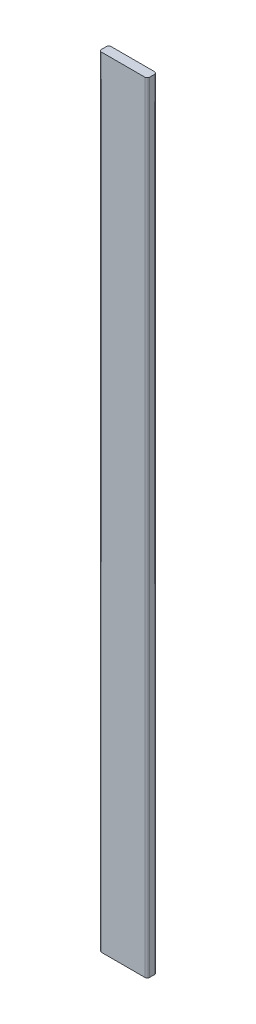
ISO-10303-21;
HEADER;
FILE_DESCRIPTION(('STEP AP214'),'2;1');
FILE_NAME('part.step','',(''),(''),'','','');
FILE_SCHEMA(('AUTOMOTIVE_DESIGN { 1 0 10303 214 1 1 1 1 }'));
ENDSEC;
DATA;
#1=APPLICATION_CONTEXT('core data for automotive mechanical design processes');
#2=APPLICATION_PROTOCOL_DEFINITION('international standard','automotive_design',2000,#1);
#3=PRODUCT_CONTEXT('',#1,'mechanical');
#4=PRODUCT('Part','Part','',(#3));
#5=PRODUCT_RELATED_PRODUCT_CATEGORY('part','',(#4));
#6=PRODUCT_DEFINITION_FORMATION('','',#4);
#7=PRODUCT_DEFINITION_CONTEXT('part definition',#1,'design');
#8=PRODUCT_DEFINITION('design','',#6,#7);
#9=PRODUCT_DEFINITION_SHAPE('','',#8);
#10=(LENGTH_UNIT() NAMED_UNIT(*) SI_UNIT(.MILLI.,.METRE.));
#11=(NAMED_UNIT(*) PLANE_ANGLE_UNIT() SI_UNIT($,.RADIAN.));
#12=(NAMED_UNIT(*) SI_UNIT($,.STERADIAN.) SOLID_ANGLE_UNIT());
#13=UNCERTAINTY_MEASURE_WITH_UNIT(LENGTH_MEASURE(1.E-05),#10,'distance_accuracy_value','');
#14=(GEOMETRIC_REPRESENTATION_CONTEXT(3) GLOBAL_UNCERTAINTY_ASSIGNED_CONTEXT((#13)) GLOBAL_UNIT_ASSIGNED_CONTEXT((#10,
#11,#12)) REPRESENTATION_CONTEXT('',''));
#15=CARTESIAN_POINT('',(0.,0.,0.));
#16=DIRECTION('',(0.,0.,1.));
#17=DIRECTION('',(1.,0.,0.));
#18=AXIS2_PLACEMENT_3D('',#15,#16,#17);
#19=CARTESIAN_POINT('',(-381.578947368421,1547.63157894737,20.));
#20=DIRECTION('',(1.,0.,0.));
#21=DIRECTION('',(0.,1.,0.));
#22=AXIS2_PLACEMENT_3D('',#19,#20,#21);
#23=PLANE('',#22);
#24=DIRECTION('',(0.,0.,-1.));
#25=VECTOR('',#24,1.);
#26=CARTESIAN_POINT('',(-381.578947368421,1547.63157894737,20.));
#27=LINE('',#26,#25);
#28=CARTESIAN_POINT('',(-381.578947368421,1547.63157894737,15.));
#29=VERTEX_POINT('',#28);
#30=CARTESIAN_POINT('',(-381.578947368421,1547.63157894737,5.));
#31=VERTEX_POINT('',#30);
#32=EDGE_CURVE('E161',#29,#31,#27,.T.);
#33=ORIENTED_EDGE('',*,*,#32,.T.);
#34=DIRECTION('',(0.,-1.,0.));
#35=VECTOR('',#34,1.);
#36=CARTESIAN_POINT('',(-381.578947368421,1547.63157894737,5.));
#37=LINE('',#36,#35);
#38=CARTESIAN_POINT('',(-381.57894736842,-72.3684210526315,5.));
#39=VERTEX_POINT('',#38);
#40=EDGE_CURVE('E117',#31,#39,#37,.T.);
#41=ORIENTED_EDGE('',*,*,#40,.T.);
#42=DIRECTION('',(0.,0.,-1.));
#43=VECTOR('',#42,1.);
#44=CARTESIAN_POINT('',(-381.57894736842,-72.3684210526315,20.));
#45=LINE('',#44,#43);
#46=CARTESIAN_POINT('',(-381.57894736842,-72.3684210526315,15.));
#47=VERTEX_POINT('',#46);
#48=EDGE_CURVE('E101',#47,#39,#45,.T.);
#49=ORIENTED_EDGE('',*,*,#48,.F.);
#50=DIRECTION('',(0.,-1.,0.));
#51=VECTOR('',#50,1.);
#52=CARTESIAN_POINT('',(-381.578947368421,1547.63157894737,15.));
#53=LINE('',#52,#51);
#54=EDGE_CURVE('E114',#47,#29,#53,.F.);
#55=ORIENTED_EDGE('',*,*,#54,.T.);
#56=EDGE_LOOP('',(#33,#41,#49,#55));
#57=FACE_BOUND('',#56,.T.);
#58=ADVANCED_FACE('F32',(#57),#23,.F.);
#59=CARTESIAN_POINT('',(-381.57894736842,-72.3684210526315,20.));
#60=DIRECTION('',(0.,1.,0.));
#61=DIRECTION('',(0.,0.,1.));
#62=AXIS2_PLACEMENT_3D('',#59,#60,#61);
#63=PLANE('',#62);
#64=ORIENTED_EDGE('',*,*,#48,.T.);
#65=CARTESIAN_POINT('',(-376.57894736842,-72.3684210526314,5.));
#66=DIRECTION('',(0.,1.,0.));
#67=DIRECTION('',(0.,0.,1.));
#68=AXIS2_PLACEMENT_3D('',#65,#66,#67);
#69=CIRCLE('',#68,5.);
#70=CARTESIAN_POINT('',(-376.57894736842,-72.3684210526315,0.));
#71=VERTEX_POINT('',#70);
#72=EDGE_CURVE('E108',#39,#71,#69,.F.);
#73=ORIENTED_EDGE('',*,*,#72,.T.);
#74=DIRECTION('',(1.,0.,0.));
#75=VECTOR('',#74,1.);
#76=CARTESIAN_POINT('',(-381.57894736842,-72.3684210526315,0.));
#77=LINE('',#76,#75);
#78=CARTESIAN_POINT('',(-286.57894736842,-72.3684210526315,0.));
#79=VERTEX_POINT('',#78);
#80=EDGE_CURVE('E167',#71,#79,#77,.T.);
#81=ORIENTED_EDGE('',*,*,#80,.T.);
#82=CARTESIAN_POINT('',(-286.57894736842,-72.3684210526314,5.));
#83=DIRECTION('',(0.,1.,0.));
#84=DIRECTION('',(0.,0.,1.));
#85=AXIS2_PLACEMENT_3D('',#82,#83,#84);
#86=CIRCLE('',#85,5.);
#87=CARTESIAN_POINT('',(-281.57894736842,-72.3684210526315,5.));
#88=VERTEX_POINT('',#87);
#89=EDGE_CURVE('E109',#79,#88,#86,.F.);
#90=ORIENTED_EDGE('',*,*,#89,.T.);
#91=DIRECTION('',(0.,0.,-1.));
#92=VECTOR('',#91,1.);
#93=CARTESIAN_POINT('',(-281.57894736842,-72.3684210526315,20.));
#94=LINE('',#93,#92);
#95=CARTESIAN_POINT('',(-281.57894736842,-72.3684210526315,15.));
#96=VERTEX_POINT('',#95);
#97=EDGE_CURVE('E118',#96,#88,#94,.T.);
#98=ORIENTED_EDGE('',*,*,#97,.F.);
#99=CARTESIAN_POINT('',(-286.57894736842,-72.3684210526315,15.));
#100=DIRECTION('',(0.,1.,0.));
#101=DIRECTION('',(0.,0.,1.));
#102=AXIS2_PLACEMENT_3D('',#99,#100,#101);
#103=CIRCLE('',#102,5.);
#104=CARTESIAN_POINT('',(-286.57894736842,-72.3684210526315,20.));
#105=VERTEX_POINT('',#104);
#106=EDGE_CURVE('E124',#96,#105,#103,.F.);
#107=ORIENTED_EDGE('',*,*,#106,.T.);
#108=DIRECTION('',(1.,0.,0.));
#109=VECTOR('',#108,1.);
#110=CARTESIAN_POINT('',(-381.57894736842,-72.3684210526315,20.));
#111=LINE('',#110,#109);
#112=CARTESIAN_POINT('',(-376.57894736842,-72.3684210526315,20.));
#113=VERTEX_POINT('',#112);
#114=EDGE_CURVE('E103',#113,#105,#111,.T.);
#115=ORIENTED_EDGE('',*,*,#114,.F.);
#116=CARTESIAN_POINT('',(-376.57894736842,-72.3684210526315,15.));
#117=DIRECTION('',(0.,1.,0.));
#118=DIRECTION('',(0.,0.,1.));
#119=AXIS2_PLACEMENT_3D('',#116,#117,#118);
#120=CIRCLE('',#119,5.);
#121=EDGE_CURVE('E98',#113,#47,#120,.F.);
#122=ORIENTED_EDGE('',*,*,#121,.T.);
#123=EDGE_LOOP('',(#64,#73,#81,#90,#98,#107,#115,#122));
#124=FACE_BOUND('',#123,.T.);
#125=ADVANCED_FACE('F100',(#124),#63,.F.);
#126=CARTESIAN_POINT('',(-281.578947368421,1547.63157894737,20.));
#127=DIRECTION('',(-1.,0.,0.));
#128=DIRECTION('',(0.,-1.,0.));
#129=AXIS2_PLACEMENT_3D('',#126,#127,#128);
#130=PLANE('',#129);
#131=ORIENTED_EDGE('',*,*,#97,.T.);
#132=DIRECTION('',(0.,1.,0.));
#133=VECTOR('',#132,1.);
#134=CARTESIAN_POINT('',(-281.578947368421,1547.63157894737,5.));
#135=LINE('',#134,#133);
#136=CARTESIAN_POINT('',(-281.578947368421,1547.63157894737,5.));
#137=VERTEX_POINT('',#136);
#138=EDGE_CURVE('E11',#88,#137,#135,.T.);
#139=ORIENTED_EDGE('',*,*,#138,.T.);
#140=DIRECTION('',(0.,0.,-1.));
#141=VECTOR('',#140,1.);
#142=CARTESIAN_POINT('',(-281.578947368421,1547.63157894737,20.));
#143=LINE('',#142,#141);
#144=CARTESIAN_POINT('',(-281.578947368421,1547.63157894737,15.));
#145=VERTEX_POINT('',#144);
#146=EDGE_CURVE('E149',#145,#137,#143,.T.);
#147=ORIENTED_EDGE('',*,*,#146,.F.);
#148=DIRECTION('',(0.,1.,0.));
#149=VECTOR('',#148,1.);
#150=CARTESIAN_POINT('',(-281.57894736842,-72.3684210526315,15.));
#151=LINE('',#150,#149);
#152=EDGE_CURVE('E40',#145,#96,#151,.F.);
#153=ORIENTED_EDGE('',*,*,#152,.T.);
#154=EDGE_LOOP('',(#131,#139,#147,#153));
#155=FACE_BOUND('',#154,.T.);
#156=ADVANCED_FACE('F148',(#155),#130,.F.);
#157=CARTESIAN_POINT('',(-381.578947368421,1547.63157894737,20.));
#158=DIRECTION('',(0.,-1.,0.));
#159=DIRECTION('',(0.,0.,-1.));
#160=AXIS2_PLACEMENT_3D('',#157,#158,#159);
#161=PLANE('',#160);
#162=DIRECTION('',(-1.,0.,0.));
#163=VECTOR('',#162,1.);
#164=CARTESIAN_POINT('',(-381.578947368421,1547.63157894737,0.));
#165=LINE('',#164,#163);
#166=CARTESIAN_POINT('',(-286.578947368421,1547.63157894737,0.));
#167=VERTEX_POINT('',#166);
#168=CARTESIAN_POINT('',(-376.578947368421,1547.63157894737,0.));
#169=VERTEX_POINT('',#168);
#170=EDGE_CURVE('E164',#167,#169,#165,.T.);
#171=ORIENTED_EDGE('',*,*,#170,.T.);
#172=CARTESIAN_POINT('',(-376.578947368421,1547.63157894737,5.));
#173=DIRECTION('',(0.,-1.,0.));
#174=DIRECTION('',(0.,0.,-1.));
#175=AXIS2_PLACEMENT_3D('',#172,#173,#174);
#176=CIRCLE('',#175,5.);
#177=EDGE_CURVE('E138',#169,#31,#176,.F.);
#178=ORIENTED_EDGE('',*,*,#177,.T.);
#179=ORIENTED_EDGE('',*,*,#32,.F.);
#180=CARTESIAN_POINT('',(-376.578947368421,1547.63157894737,15.));
#181=DIRECTION('',(0.,-1.,0.));
#182=DIRECTION('',(0.,0.,-1.));
#183=AXIS2_PLACEMENT_3D('',#180,#181,#182);
#184=CIRCLE('',#183,5.);
#185=CARTESIAN_POINT('',(-376.578947368421,1547.63157894737,20.));
#186=VERTEX_POINT('',#185);
#187=EDGE_CURVE('E122',#29,#186,#184,.F.);
#188=ORIENTED_EDGE('',*,*,#187,.T.);
#189=DIRECTION('',(-1.,0.,0.));
#190=VECTOR('',#189,1.);
#191=CARTESIAN_POINT('',(-381.578947368421,1547.63157894737,20.));
#192=LINE('',#191,#190);
#193=CARTESIAN_POINT('',(-286.578947368421,1547.63157894737,20.));
#194=VERTEX_POINT('',#193);
#195=EDGE_CURVE('E158',#194,#186,#192,.T.);
#196=ORIENTED_EDGE('',*,*,#195,.F.);
#197=CARTESIAN_POINT('',(-286.578947368421,1547.63157894737,15.));
#198=DIRECTION('',(0.,-1.,0.));
#199=DIRECTION('',(0.,0.,-1.));
#200=AXIS2_PLACEMENT_3D('',#197,#198,#199);
#201=CIRCLE('',#200,5.);
#202=EDGE_CURVE('E54',#194,#145,#201,.F.);
#203=ORIENTED_EDGE('',*,*,#202,.T.);
#204=ORIENTED_EDGE('',*,*,#146,.T.);
#205=CARTESIAN_POINT('',(-286.578947368421,1547.63157894737,5.));
#206=DIRECTION('',(0.,-1.,0.));
#207=DIRECTION('',(0.,0.,-1.));
#208=AXIS2_PLACEMENT_3D('',#205,#206,#207);
#209=CIRCLE('',#208,5.);
#210=EDGE_CURVE('E47',#137,#167,#209,.F.);
#211=ORIENTED_EDGE('',*,*,#210,.T.);
#212=EDGE_LOOP('',(#171,#178,#179,#188,#196,#203,#204,#211));
#213=FACE_BOUND('',#212,.T.);
#214=ADVANCED_FACE('F160',(#213),#161,.F.);
#215=CARTESIAN_POINT('',(0.,0.,20.));
#216=DIRECTION('',(0.,0.,1.));
#217=DIRECTION('',(1.,0.,0.));
#218=AXIS2_PLACEMENT_3D('',#215,#216,#217);
#219=PLANE('',#218);
#220=ORIENTED_EDGE('',*,*,#195,.T.);
#221=DIRECTION('',(0.,-1.,0.));
#222=VECTOR('',#221,1.);
#223=CARTESIAN_POINT('',(-376.57894736842,-72.3684210526315,20.));
#224=LINE('',#223,#222);
#225=EDGE_CURVE('E143',#186,#113,#224,.T.);
#226=ORIENTED_EDGE('',*,*,#225,.T.);
#227=ORIENTED_EDGE('',*,*,#114,.T.);
#228=DIRECTION('',(0.,1.,0.));
#229=VECTOR('',#228,1.);
#230=CARTESIAN_POINT('',(-286.578947368421,1547.63157894737,20.));
#231=LINE('',#230,#229);
#232=EDGE_CURVE('E140',#105,#194,#231,.T.);
#233=ORIENTED_EDGE('',*,*,#232,.T.);
#234=EDGE_LOOP('',(#220,#226,#227,#233));
#235=FACE_BOUND('',#234,.T.);
#236=ADVANCED_FACE('F157',(#235),#219,.T.);
#237=CARTESIAN_POINT('',(0.,0.,0.));
#238=DIRECTION('',(0.,0.,1.));
#239=DIRECTION('',(1.,0.,0.));
#240=AXIS2_PLACEMENT_3D('',#237,#238,#239);
#241=PLANE('',#240);
#242=ORIENTED_EDGE('',*,*,#80,.F.);
#243=DIRECTION('',(0.,-1.,0.));
#244=VECTOR('',#243,1.);
#245=CARTESIAN_POINT('',(-376.57894736842,0.,0.));
#246=LINE('',#245,#244);
#247=EDGE_CURVE('E133',#71,#169,#246,.F.);
#248=ORIENTED_EDGE('',*,*,#247,.T.);
#249=ORIENTED_EDGE('',*,*,#170,.F.);
#250=DIRECTION('',(0.,1.,0.));
#251=VECTOR('',#250,1.);
#252=CARTESIAN_POINT('',(-286.57894736842,0.,0.));
#253=LINE('',#252,#251);
#254=EDGE_CURVE('E131',#167,#79,#253,.F.);
#255=ORIENTED_EDGE('',*,*,#254,.T.);
#256=EDGE_LOOP('',(#242,#248,#249,#255));
#257=FACE_BOUND('',#256,.T.);
#258=ADVANCED_FACE('F174',(#257),#241,.F.);
#259=CARTESIAN_POINT('',(-376.578947368421,1547.63157894737,5.));
#260=DIRECTION('',(0.,-1.,0.));
#261=DIRECTION('',(1.,0.,0.));
#262=AXIS2_PLACEMENT_3D('',#259,#260,#261);
#263=CYLINDRICAL_SURFACE('',#262,5.);
#264=ORIENTED_EDGE('',*,*,#177,.F.);
#265=ORIENTED_EDGE('',*,*,#247,.F.);
#266=ORIENTED_EDGE('',*,*,#72,.F.);
#267=ORIENTED_EDGE('',*,*,#40,.F.);
#268=EDGE_LOOP('',(#264,#265,#266,#267));
#269=FACE_BOUND('',#268,.T.);
#270=ADVANCED_FACE('F182',(#269),#263,.T.);
#271=CARTESIAN_POINT('',(-376.57894736842,0.,15.));
#272=DIRECTION('',(0.,1.,0.));
#273=DIRECTION('',(-1.,0.,0.));
#274=AXIS2_PLACEMENT_3D('',#271,#272,#273);
#275=CYLINDRICAL_SURFACE('',#274,5.);
#276=ORIENTED_EDGE('',*,*,#187,.F.);
#277=ORIENTED_EDGE('',*,*,#54,.F.);
#278=ORIENTED_EDGE('',*,*,#121,.F.);
#279=ORIENTED_EDGE('',*,*,#225,.F.);
#280=EDGE_LOOP('',(#276,#277,#278,#279));
#281=FACE_BOUND('',#280,.T.);
#282=ADVANCED_FACE('F121',(#281),#275,.T.);
#283=CARTESIAN_POINT('',(-286.578947368421,1547.63157894737,5.));
#284=DIRECTION('',(0.,1.,0.));
#285=DIRECTION('',(-1.,0.,0.));
#286=AXIS2_PLACEMENT_3D('',#283,#284,#285);
#287=CYLINDRICAL_SURFACE('',#286,5.);
#288=ORIENTED_EDGE('',*,*,#89,.F.);
#289=ORIENTED_EDGE('',*,*,#254,.F.);
#290=ORIENTED_EDGE('',*,*,#210,.F.);
#291=ORIENTED_EDGE('',*,*,#138,.F.);
#292=EDGE_LOOP('',(#288,#289,#290,#291));
#293=FACE_BOUND('',#292,.T.);
#294=ADVANCED_FACE('F176',(#293),#287,.T.);
#295=CARTESIAN_POINT('',(-286.57894736842,0.,15.));
#296=DIRECTION('',(0.,-1.,0.));
#297=DIRECTION('',(1.,0.,0.));
#298=AXIS2_PLACEMENT_3D('',#295,#296,#297);
#299=CYLINDRICAL_SURFACE('',#298,5.);
#300=ORIENTED_EDGE('',*,*,#106,.F.);
#301=ORIENTED_EDGE('',*,*,#152,.F.);
#302=ORIENTED_EDGE('',*,*,#202,.F.);
#303=ORIENTED_EDGE('',*,*,#232,.F.);
#304=EDGE_LOOP('',(#300,#301,#302,#303));
#305=FACE_BOUND('',#304,.T.);
#306=ADVANCED_FACE('F34',(#305),#299,.T.);
#307=CLOSED_SHELL('',(#58,#125,#156,#214,#236,#258,#270,#282,#294,#306));
#308=MANIFOLD_SOLID_BREP('B2',#307);
#309=ADVANCED_BREP_SHAPE_REPRESENTATION('',(#18,#308),#14);
#310=SHAPE_DEFINITION_REPRESENTATION(#9,#309);
ENDSEC;
END-ISO-10303-21;
